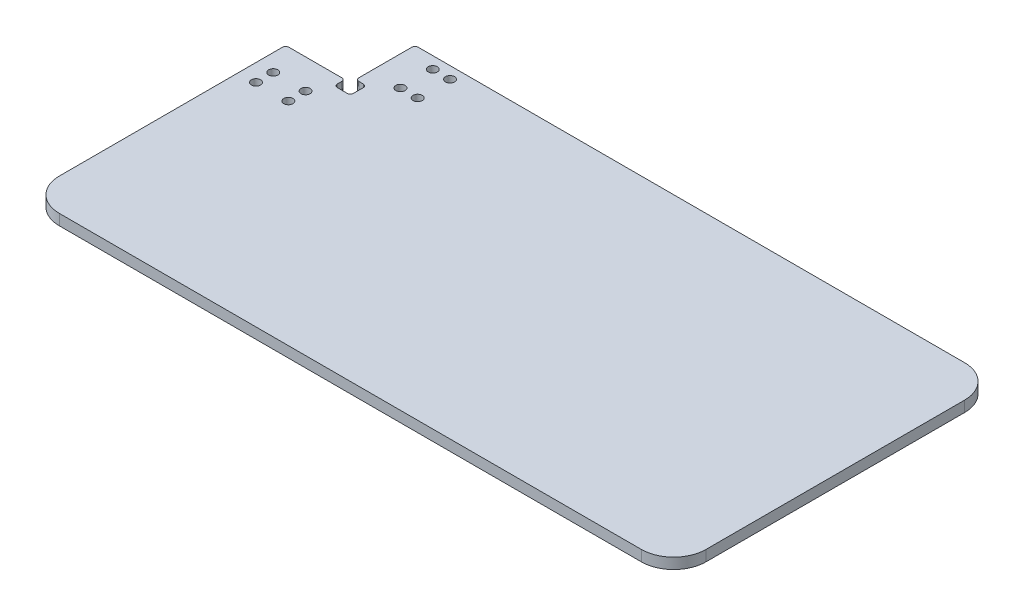
ISO-10303-21;
HEADER;
FILE_DESCRIPTION(('STEP AP214'),'2;1');
FILE_NAME('part.step','',(''),(''),'','','');
FILE_SCHEMA(('AUTOMOTIVE_DESIGN { 1 0 10303 214 1 1 1 1 }'));
ENDSEC;
DATA;
#1=APPLICATION_CONTEXT('core data for automotive mechanical design processes');
#2=APPLICATION_PROTOCOL_DEFINITION('international standard','automotive_design',2000,#1);
#3=PRODUCT_CONTEXT('',#1,'mechanical');
#4=PRODUCT('Part','Part','',(#3));
#5=PRODUCT_RELATED_PRODUCT_CATEGORY('part','',(#4));
#6=PRODUCT_DEFINITION_FORMATION('','',#4);
#7=PRODUCT_DEFINITION_CONTEXT('part definition',#1,'design');
#8=PRODUCT_DEFINITION('design','',#6,#7);
#9=PRODUCT_DEFINITION_SHAPE('','',#8);
#10=(LENGTH_UNIT() NAMED_UNIT(*) SI_UNIT(.MILLI.,.METRE.));
#11=(NAMED_UNIT(*) PLANE_ANGLE_UNIT() SI_UNIT($,.RADIAN.));
#12=(NAMED_UNIT(*) SI_UNIT($,.STERADIAN.) SOLID_ANGLE_UNIT());
#13=UNCERTAINTY_MEASURE_WITH_UNIT(LENGTH_MEASURE(1.E-05),#10,'distance_accuracy_value','');
#14=(GEOMETRIC_REPRESENTATION_CONTEXT(3) GLOBAL_UNCERTAINTY_ASSIGNED_CONTEXT((#13)) GLOBAL_UNIT_ASSIGNED_CONTEXT((#10,
#11,#12)) REPRESENTATION_CONTEXT('',''));
#15=CARTESIAN_POINT('',(0.,0.,0.));
#16=DIRECTION('',(0.,0.,1.));
#17=DIRECTION('',(1.,0.,0.));
#18=AXIS2_PLACEMENT_3D('',#15,#16,#17);
#19=CARTESIAN_POINT('',(0.,10.,0.));
#20=DIRECTION('',(0.,1.,0.));
#21=DIRECTION('',(0.,0.,1.));
#22=AXIS2_PLACEMENT_3D('',#19,#20,#21);
#23=PLANE('',#22);
#24=CARTESIAN_POINT('',(16.,10.,103.5));
#25=DIRECTION('',(0.,1.,0.));
#26=DIRECTION('',(0.,0.,1.));
#27=AXIS2_PLACEMENT_3D('',#24,#25,#26);
#28=CIRCLE('',#27,4.25000000000001);
#29=CARTESIAN_POINT('',(16.,10.,107.75));
#30=VERTEX_POINT('',#29);
#31=EDGE_CURVE('E481',#30,#30,#28,.T.);
#32=ORIENTED_EDGE('',*,*,#31,.F.);
#33=EDGE_LOOP('',(#32));
#34=FACE_BOUND('',#33,.T.);
#35=CARTESIAN_POINT('',(16.,10.,87.5));
#36=DIRECTION('',(0.,1.,0.));
#37=DIRECTION('',(0.,0.,1.));
#38=AXIS2_PLACEMENT_3D('',#35,#36,#37);
#39=CIRCLE('',#38,4.25000000000001);
#40=CARTESIAN_POINT('',(16.,10.,91.75));
#41=VERTEX_POINT('',#40);
#42=EDGE_CURVE('E469',#41,#41,#39,.T.);
#43=ORIENTED_EDGE('',*,*,#42,.F.);
#44=EDGE_LOOP('',(#43));
#45=FACE_BOUND('',#44,.T.);
#46=CARTESIAN_POINT('',(103.5,10.,41.));
#47=DIRECTION('',(0.,1.,0.));
#48=DIRECTION('',(0.,0.,1.));
#49=AXIS2_PLACEMENT_3D('',#46,#47,#48);
#50=CIRCLE('',#49,4.25000000000001);
#51=CARTESIAN_POINT('',(103.5,10.,45.25));
#52=VERTEX_POINT('',#51);
#53=EDGE_CURVE('E457',#52,#52,#50,.T.);
#54=ORIENTED_EDGE('',*,*,#53,.F.);
#55=EDGE_LOOP('',(#54));
#56=FACE_BOUND('',#55,.T.);
#57=CARTESIAN_POINT('',(103.5,10.,11.));
#58=DIRECTION('',(0.,1.,0.));
#59=DIRECTION('',(0.,0.,1.));
#60=AXIS2_PLACEMENT_3D('',#57,#58,#59);
#61=CIRCLE('',#60,4.25000000000001);
#62=CARTESIAN_POINT('',(103.5,10.,15.25));
#63=VERTEX_POINT('',#62);
#64=EDGE_CURVE('E210',#63,#63,#61,.T.);
#65=ORIENTED_EDGE('',*,*,#64,.F.);
#66=EDGE_LOOP('',(#65));
#67=FACE_BOUND('',#66,.T.);
#68=DIRECTION('',(0.,0.,-1.));
#69=VECTOR('',#68,1.);
#70=CARTESIAN_POINT('',(55.,10.,70.));
#71=LINE('',#70,#69);
#72=CARTESIAN_POINT('',(55.,10.,67.));
#73=VERTEX_POINT('',#72);
#74=CARTESIAN_POINT('',(55.,10.,63.));
#75=VERTEX_POINT('',#74);
#76=EDGE_CURVE('E324',#73,#75,#71,.T.);
#77=ORIENTED_EDGE('',*,*,#76,.T.);
#78=CARTESIAN_POINT('',(52.,10.,63.));
#79=DIRECTION('',(0.,1.,0.));
#80=DIRECTION('',(0.,0.,1.));
#81=AXIS2_PLACEMENT_3D('',#78,#79,#80);
#82=CIRCLE('',#81,3.);
#83=CARTESIAN_POINT('',(52.,10.,60.));
#84=VERTEX_POINT('',#83);
#85=EDGE_CURVE('E291',#75,#84,#82,.T.);
#86=ORIENTED_EDGE('',*,*,#85,.T.);
#87=DIRECTION('',(-1.,0.,0.));
#88=VECTOR('',#87,1.);
#89=CARTESIAN_POINT('',(55.,10.,60.));
#90=LINE('',#89,#88);
#91=CARTESIAN_POINT('',(3.00000000000002,10.,60.));
#92=VERTEX_POINT('',#91);
#93=EDGE_CURVE('E330',#84,#92,#90,.T.);
#94=ORIENTED_EDGE('',*,*,#93,.T.);
#95=CARTESIAN_POINT('',(3.,10.,63.));
#96=DIRECTION('',(0.,1.,0.));
#97=DIRECTION('',(0.,0.,1.));
#98=AXIS2_PLACEMENT_3D('',#95,#96,#97);
#99=CIRCLE('',#98,3.);
#100=CARTESIAN_POINT('',(0.,10.,63.));
#101=VERTEX_POINT('',#100);
#102=EDGE_CURVE('E52',#92,#101,#99,.T.);
#103=ORIENTED_EDGE('',*,*,#102,.T.);
#104=DIRECTION('',(0.,0.,1.));
#105=VECTOR('',#104,1.);
#106=CARTESIAN_POINT('',(0.,10.,60.));
#107=LINE('',#106,#105);
#108=CARTESIAN_POINT('',(0.,10.,270.));
#109=VERTEX_POINT('',#108);
#110=EDGE_CURVE('E332',#101,#109,#107,.T.);
#111=ORIENTED_EDGE('',*,*,#110,.T.);
#112=CARTESIAN_POINT('',(30.0000000000001,10.,270.));
#113=DIRECTION('',(0.,1.,0.));
#114=DIRECTION('',(0.,0.,1.));
#115=AXIS2_PLACEMENT_3D('',#112,#113,#114);
#116=CIRCLE('',#115,30.);
#117=CARTESIAN_POINT('',(30.0000000000001,10.,300.));
#118=VERTEX_POINT('',#117);
#119=EDGE_CURVE('E242',#109,#118,#116,.T.);
#120=ORIENTED_EDGE('',*,*,#119,.T.);
#121=DIRECTION('',(1.,0.,0.));
#122=VECTOR('',#121,1.);
#123=CARTESIAN_POINT('',(1.02132162786543E-13,10.,300.));
#124=LINE('',#123,#122);
#125=CARTESIAN_POINT('',(570.,10.,300.));
#126=VERTEX_POINT('',#125);
#127=EDGE_CURVE('E198',#118,#126,#124,.T.);
#128=ORIENTED_EDGE('',*,*,#127,.T.);
#129=CARTESIAN_POINT('',(570.,10.,270.));
#130=DIRECTION('',(0.,1.,0.));
#131=DIRECTION('',(0.,0.,1.));
#132=AXIS2_PLACEMENT_3D('',#129,#130,#131);
#133=CIRCLE('',#132,30.);
#134=CARTESIAN_POINT('',(600.,10.,270.));
#135=VERTEX_POINT('',#134);
#136=EDGE_CURVE('E240',#126,#135,#133,.T.);
#137=ORIENTED_EDGE('',*,*,#136,.T.);
#138=DIRECTION('',(0.,0.,-1.));
#139=VECTOR('',#138,1.);
#140=CARTESIAN_POINT('',(600.,10.,0.));
#141=LINE('',#140,#139);
#142=CARTESIAN_POINT('',(600.,10.,30.));
#143=VERTEX_POINT('',#142);
#144=EDGE_CURVE('E232',#135,#143,#141,.T.);
#145=ORIENTED_EDGE('',*,*,#144,.T.);
#146=CARTESIAN_POINT('',(570.,10.,30.));
#147=DIRECTION('',(0.,1.,0.));
#148=DIRECTION('',(0.,0.,1.));
#149=AXIS2_PLACEMENT_3D('',#146,#147,#148);
#150=CIRCLE('',#149,30.);
#151=CARTESIAN_POINT('',(570.,10.,0.));
#152=VERTEX_POINT('',#151);
#153=EDGE_CURVE('E244',#143,#152,#150,.T.);
#154=ORIENTED_EDGE('',*,*,#153,.T.);
#155=DIRECTION('',(-1.,0.,0.));
#156=VECTOR('',#155,1.);
#157=CARTESIAN_POINT('',(60.,10.,0.));
#158=LINE('',#157,#156);
#159=CARTESIAN_POINT('',(63.,10.,0.));
#160=VERTEX_POINT('',#159);
#161=EDGE_CURVE('E196',#152,#160,#158,.T.);
#162=ORIENTED_EDGE('',*,*,#161,.T.);
#163=CARTESIAN_POINT('',(63.,10.,3.));
#164=DIRECTION('',(0.,1.,0.));
#165=DIRECTION('',(0.,0.,1.));
#166=AXIS2_PLACEMENT_3D('',#163,#164,#165);
#167=CIRCLE('',#166,3.);
#168=CARTESIAN_POINT('',(60.,10.,3.));
#169=VERTEX_POINT('',#168);
#170=EDGE_CURVE('E287',#160,#169,#167,.T.);
#171=ORIENTED_EDGE('',*,*,#170,.T.);
#172=DIRECTION('',(0.,0.,1.));
#173=VECTOR('',#172,1.);
#174=CARTESIAN_POINT('',(60.,10.,0.));
#175=LINE('',#174,#173);
#176=CARTESIAN_POINT('',(60.,10.,52.));
#177=VERTEX_POINT('',#176);
#178=EDGE_CURVE('E442',#169,#177,#175,.T.);
#179=ORIENTED_EDGE('',*,*,#178,.T.);
#180=CARTESIAN_POINT('',(63.,10.,52.));
#181=DIRECTION('',(0.,1.,0.));
#182=DIRECTION('',(0.,0.,1.));
#183=AXIS2_PLACEMENT_3D('',#180,#181,#182);
#184=CIRCLE('',#183,3.);
#185=CARTESIAN_POINT('',(63.,10.,55.));
#186=VERTEX_POINT('',#185);
#187=EDGE_CURVE('E289',#177,#186,#184,.T.);
#188=ORIENTED_EDGE('',*,*,#187,.T.);
#189=DIRECTION('',(1.,0.,0.));
#190=VECTOR('',#189,1.);
#191=CARTESIAN_POINT('',(60.,10.,55.));
#192=LINE('',#191,#190);
#193=CARTESIAN_POINT('',(67.,10.,55.));
#194=VERTEX_POINT('',#193);
#195=EDGE_CURVE('E441',#186,#194,#192,.T.);
#196=ORIENTED_EDGE('',*,*,#195,.T.);
#197=CARTESIAN_POINT('',(67.,10.,58.));
#198=DIRECTION('',(0.,1.,0.));
#199=DIRECTION('',(0.,0.,1.));
#200=AXIS2_PLACEMENT_3D('',#197,#198,#199);
#201=CIRCLE('',#200,3.);
#202=CARTESIAN_POINT('',(70.,10.,58.));
#203=VERTEX_POINT('',#202);
#204=EDGE_CURVE('E304',#194,#203,#201,.F.);
#205=ORIENTED_EDGE('',*,*,#204,.T.);
#206=DIRECTION('',(0.,0.,1.));
#207=VECTOR('',#206,1.);
#208=CARTESIAN_POINT('',(70.,10.,55.));
#209=LINE('',#208,#207);
#210=CARTESIAN_POINT('',(70.,10.,67.));
#211=VERTEX_POINT('',#210);
#212=EDGE_CURVE('E334',#203,#211,#209,.T.);
#213=ORIENTED_EDGE('',*,*,#212,.T.);
#214=CARTESIAN_POINT('',(67.,10.,67.));
#215=DIRECTION('',(0.,1.,0.));
#216=DIRECTION('',(0.,0.,1.));
#217=AXIS2_PLACEMENT_3D('',#214,#215,#216);
#218=CIRCLE('',#217,3.);
#219=CARTESIAN_POINT('',(67.,10.,70.));
#220=VERTEX_POINT('',#219);
#221=EDGE_CURVE('E308',#211,#220,#218,.F.);
#222=ORIENTED_EDGE('',*,*,#221,.T.);
#223=DIRECTION('',(-1.,0.,0.));
#224=VECTOR('',#223,1.);
#225=CARTESIAN_POINT('',(70.,10.,70.));
#226=LINE('',#225,#224);
#227=CARTESIAN_POINT('',(58.,10.,70.));
#228=VERTEX_POINT('',#227);
#229=EDGE_CURVE('E326',#220,#228,#226,.T.);
#230=ORIENTED_EDGE('',*,*,#229,.T.);
#231=CARTESIAN_POINT('',(58.,10.,67.));
#232=DIRECTION('',(0.,1.,0.));
#233=DIRECTION('',(0.,0.,1.));
#234=AXIS2_PLACEMENT_3D('',#231,#232,#233);
#235=CIRCLE('',#234,3.);
#236=EDGE_CURVE('E11',#228,#73,#235,.F.);
#237=ORIENTED_EDGE('',*,*,#236,.T.);
#238=EDGE_LOOP('',(#77,#86,#94,#103,#111,#120,#128,#137,#145,#154,#162,#171,#179,#188,#196,#205,
#213,#222,#230,#237));
#239=FACE_BOUND('',#238,.T.);
#240=CARTESIAN_POINT('',(87.5,10.,11.));
#241=DIRECTION('',(0.,1.,0.));
#242=DIRECTION('',(0.,0.,1.));
#243=AXIS2_PLACEMENT_3D('',#240,#241,#242);
#244=CIRCLE('',#243,4.25000000000001);
#245=CARTESIAN_POINT('',(87.5,10.,15.25));
#246=VERTEX_POINT('',#245);
#247=EDGE_CURVE('E451',#246,#246,#244,.T.);
#248=ORIENTED_EDGE('',*,*,#247,.F.);
#249=EDGE_LOOP('',(#248));
#250=FACE_BOUND('',#249,.T.);
#251=CARTESIAN_POINT('',(87.5,10.,41.));
#252=DIRECTION('',(0.,1.,0.));
#253=DIRECTION('',(0.,0.,1.));
#254=AXIS2_PLACEMENT_3D('',#251,#252,#253);
#255=CIRCLE('',#254,4.25000000000001);
#256=CARTESIAN_POINT('',(87.5,10.,45.25));
#257=VERTEX_POINT('',#256);
#258=EDGE_CURVE('E463',#257,#257,#255,.T.);
#259=ORIENTED_EDGE('',*,*,#258,.F.);
#260=EDGE_LOOP('',(#259));
#261=FACE_BOUND('',#260,.T.);
#262=CARTESIAN_POINT('',(46.,10.,87.5));
#263=DIRECTION('',(0.,1.,0.));
#264=DIRECTION('',(0.,0.,1.));
#265=AXIS2_PLACEMENT_3D('',#262,#263,#264);
#266=CIRCLE('',#265,4.25000000000003);
#267=CARTESIAN_POINT('',(46.,10.,91.75));
#268=VERTEX_POINT('',#267);
#269=EDGE_CURVE('E475',#268,#268,#266,.T.);
#270=ORIENTED_EDGE('',*,*,#269,.F.);
#271=EDGE_LOOP('',(#270));
#272=FACE_BOUND('',#271,.T.);
#273=CARTESIAN_POINT('',(46.,10.,103.5));
#274=DIRECTION('',(0.,1.,0.));
#275=DIRECTION('',(0.,0.,1.));
#276=AXIS2_PLACEMENT_3D('',#273,#274,#275);
#277=CIRCLE('',#276,4.25000000000002);
#278=CARTESIAN_POINT('',(46.,10.,107.75));
#279=VERTEX_POINT('',#278);
#280=EDGE_CURVE('E487',#279,#279,#277,.T.);
#281=ORIENTED_EDGE('',*,*,#280,.F.);
#282=EDGE_LOOP('',(#281));
#283=FACE_BOUND('',#282,.T.);
#284=ADVANCED_FACE('F37',(#34,#45,#56,#67,#239,#250,#261,#272,#283),#23,.T.);
#285=CARTESIAN_POINT('',(0.,0.,0.));
#286=DIRECTION('',(0.,1.,0.));
#287=DIRECTION('',(0.,0.,1.));
#288=AXIS2_PLACEMENT_3D('',#285,#286,#287);
#289=PLANE('',#288);
#290=DIRECTION('',(-1.,0.,0.));
#291=VECTOR('',#290,1.);
#292=CARTESIAN_POINT('',(55.,0.,60.));
#293=LINE('',#292,#291);
#294=CARTESIAN_POINT('',(52.,0.,60.));
#295=VERTEX_POINT('',#294);
#296=CARTESIAN_POINT('',(3.00000000000002,0.,60.));
#297=VERTEX_POINT('',#296);
#298=EDGE_CURVE('E225',#295,#297,#293,.T.);
#299=ORIENTED_EDGE('',*,*,#298,.F.);
#300=CARTESIAN_POINT('',(52.,0.,63.));
#301=DIRECTION('',(0.,1.,0.));
#302=DIRECTION('',(0.,0.,1.));
#303=AXIS2_PLACEMENT_3D('',#300,#301,#302);
#304=CIRCLE('',#303,3.);
#305=CARTESIAN_POINT('',(55.,0.,63.));
#306=VERTEX_POINT('',#305);
#307=EDGE_CURVE('E284',#295,#306,#304,.F.);
#308=ORIENTED_EDGE('',*,*,#307,.T.);
#309=DIRECTION('',(0.,0.,-1.));
#310=VECTOR('',#309,1.);
#311=CARTESIAN_POINT('',(55.,0.,70.));
#312=LINE('',#311,#310);
#313=CARTESIAN_POINT('',(55.,0.,67.));
#314=VERTEX_POINT('',#313);
#315=EDGE_CURVE('E222',#314,#306,#312,.T.);
#316=ORIENTED_EDGE('',*,*,#315,.F.);
#317=CARTESIAN_POINT('',(58.,0.,67.));
#318=DIRECTION('',(0.,1.,0.));
#319=DIRECTION('',(0.,0.,1.));
#320=AXIS2_PLACEMENT_3D('',#317,#318,#319);
#321=CIRCLE('',#320,3.);
#322=CARTESIAN_POINT('',(58.,0.,70.));
#323=VERTEX_POINT('',#322);
#324=EDGE_CURVE('E45',#314,#323,#321,.T.);
#325=ORIENTED_EDGE('',*,*,#324,.T.);
#326=DIRECTION('',(-1.,0.,0.));
#327=VECTOR('',#326,1.);
#328=CARTESIAN_POINT('',(70.,0.,70.));
#329=LINE('',#328,#327);
#330=CARTESIAN_POINT('',(67.,0.,70.));
#331=VERTEX_POINT('',#330);
#332=EDGE_CURVE('E219',#331,#323,#329,.T.);
#333=ORIENTED_EDGE('',*,*,#332,.F.);
#334=CARTESIAN_POINT('',(67.,0.,67.));
#335=DIRECTION('',(0.,1.,0.));
#336=DIRECTION('',(0.,0.,1.));
#337=AXIS2_PLACEMENT_3D('',#334,#335,#336);
#338=CIRCLE('',#337,3.);
#339=CARTESIAN_POINT('',(70.,0.,67.));
#340=VERTEX_POINT('',#339);
#341=EDGE_CURVE('E306',#331,#340,#338,.T.);
#342=ORIENTED_EDGE('',*,*,#341,.T.);
#343=DIRECTION('',(0.,0.,1.));
#344=VECTOR('',#343,1.);
#345=CARTESIAN_POINT('',(70.,0.,55.));
#346=LINE('',#345,#344);
#347=CARTESIAN_POINT('',(70.,0.,58.));
#348=VERTEX_POINT('',#347);
#349=EDGE_CURVE('E216',#348,#340,#346,.T.);
#350=ORIENTED_EDGE('',*,*,#349,.F.);
#351=CARTESIAN_POINT('',(67.,0.,58.));
#352=DIRECTION('',(0.,1.,0.));
#353=DIRECTION('',(0.,0.,1.));
#354=AXIS2_PLACEMENT_3D('',#351,#352,#353);
#355=CIRCLE('',#354,3.);
#356=CARTESIAN_POINT('',(67.,0.,55.));
#357=VERTEX_POINT('',#356);
#358=EDGE_CURVE('E302',#348,#357,#355,.T.);
#359=ORIENTED_EDGE('',*,*,#358,.T.);
#360=DIRECTION('',(1.,0.,0.));
#361=VECTOR('',#360,1.);
#362=CARTESIAN_POINT('',(60.,0.,55.));
#363=LINE('',#362,#361);
#364=CARTESIAN_POINT('',(63.,0.,55.));
#365=VERTEX_POINT('',#364);
#366=EDGE_CURVE('E208',#365,#357,#363,.T.);
#367=ORIENTED_EDGE('',*,*,#366,.F.);
#368=CARTESIAN_POINT('',(63.,0.,52.));
#369=DIRECTION('',(0.,1.,0.));
#370=DIRECTION('',(0.,0.,1.));
#371=AXIS2_PLACEMENT_3D('',#368,#369,#370);
#372=CIRCLE('',#371,3.);
#373=CARTESIAN_POINT('',(60.,0.,52.));
#374=VERTEX_POINT('',#373);
#375=EDGE_CURVE('E282',#365,#374,#372,.F.);
#376=ORIENTED_EDGE('',*,*,#375,.T.);
#377=DIRECTION('',(0.,0.,1.));
#378=VECTOR('',#377,1.);
#379=CARTESIAN_POINT('',(60.,0.,0.));
#380=LINE('',#379,#378);
#381=CARTESIAN_POINT('',(60.,0.,3.));
#382=VERTEX_POINT('',#381);
#383=EDGE_CURVE('E205',#382,#374,#380,.T.);
#384=ORIENTED_EDGE('',*,*,#383,.F.);
#385=CARTESIAN_POINT('',(63.,0.,3.));
#386=DIRECTION('',(0.,1.,0.));
#387=DIRECTION('',(0.,0.,1.));
#388=AXIS2_PLACEMENT_3D('',#385,#386,#387);
#389=CIRCLE('',#388,3.);
#390=CARTESIAN_POINT('',(63.,0.,0.));
#391=VERTEX_POINT('',#390);
#392=EDGE_CURVE('E204',#382,#391,#389,.F.);
#393=ORIENTED_EDGE('',*,*,#392,.T.);
#394=DIRECTION('',(-1.,0.,0.));
#395=VECTOR('',#394,1.);
#396=CARTESIAN_POINT('',(60.,0.,0.));
#397=LINE('',#396,#395);
#398=CARTESIAN_POINT('',(570.,0.,0.));
#399=VERTEX_POINT('',#398);
#400=EDGE_CURVE('E193',#399,#391,#397,.T.);
#401=ORIENTED_EDGE('',*,*,#400,.F.);
#402=CARTESIAN_POINT('',(570.,0.,30.));
#403=DIRECTION('',(0.,1.,0.));
#404=DIRECTION('',(0.,0.,1.));
#405=AXIS2_PLACEMENT_3D('',#402,#403,#404);
#406=CIRCLE('',#405,30.);
#407=CARTESIAN_POINT('',(600.,0.,30.));
#408=VERTEX_POINT('',#407);
#409=EDGE_CURVE('E176',#399,#408,#406,.F.);
#410=ORIENTED_EDGE('',*,*,#409,.T.);
#411=DIRECTION('',(0.,0.,-1.));
#412=VECTOR('',#411,1.);
#413=CARTESIAN_POINT('',(600.,0.,0.));
#414=LINE('',#413,#412);
#415=CARTESIAN_POINT('',(600.,0.,270.));
#416=VERTEX_POINT('',#415);
#417=EDGE_CURVE('E206',#416,#408,#414,.T.);
#418=ORIENTED_EDGE('',*,*,#417,.F.);
#419=CARTESIAN_POINT('',(570.,0.,270.));
#420=DIRECTION('',(0.,1.,0.));
#421=DIRECTION('',(0.,0.,1.));
#422=AXIS2_PLACEMENT_3D('',#419,#420,#421);
#423=CIRCLE('',#422,30.);
#424=CARTESIAN_POINT('',(570.,0.,300.));
#425=VERTEX_POINT('',#424);
#426=EDGE_CURVE('E197',#416,#425,#423,.F.);
#427=ORIENTED_EDGE('',*,*,#426,.T.);
#428=DIRECTION('',(1.,0.,0.));
#429=VECTOR('',#428,1.);
#430=CARTESIAN_POINT('',(1.02132162786543E-13,0.,300.));
#431=LINE('',#430,#429);
#432=CARTESIAN_POINT('',(30.0000000000001,0.,300.));
#433=VERTEX_POINT('',#432);
#434=EDGE_CURVE('E230',#433,#425,#431,.T.);
#435=ORIENTED_EDGE('',*,*,#434,.F.);
#436=CARTESIAN_POINT('',(30.0000000000001,0.,270.));
#437=DIRECTION('',(0.,1.,0.));
#438=DIRECTION('',(0.,0.,1.));
#439=AXIS2_PLACEMENT_3D('',#436,#437,#438);
#440=CIRCLE('',#439,30.);
#441=CARTESIAN_POINT('',(0.,0.,270.));
#442=VERTEX_POINT('',#441);
#443=EDGE_CURVE('E187',#433,#442,#440,.F.);
#444=ORIENTED_EDGE('',*,*,#443,.T.);
#445=DIRECTION('',(0.,0.,1.));
#446=VECTOR('',#445,1.);
#447=CARTESIAN_POINT('',(0.,0.,60.));
#448=LINE('',#447,#446);
#449=CARTESIAN_POINT('',(0.,0.,63.));
#450=VERTEX_POINT('',#449);
#451=EDGE_CURVE('E228',#450,#442,#448,.T.);
#452=ORIENTED_EDGE('',*,*,#451,.F.);
#453=CARTESIAN_POINT('',(3.,0.,63.));
#454=DIRECTION('',(0.,1.,0.));
#455=DIRECTION('',(0.,0.,1.));
#456=AXIS2_PLACEMENT_3D('',#453,#454,#455);
#457=CIRCLE('',#456,3.);
#458=EDGE_CURVE('E279',#450,#297,#457,.F.);
#459=ORIENTED_EDGE('',*,*,#458,.T.);
#460=EDGE_LOOP('',(#299,#308,#316,#325,#333,#342,#350,#359,#367,#376,#384,#393,#401,#410,#418,
#427,#435,#444,#452,#459));
#461=FACE_BOUND('',#460,.T.);
#462=CARTESIAN_POINT('',(103.5,0.,11.));
#463=DIRECTION('',(0.,1.,0.));
#464=DIRECTION('',(0.,0.,1.));
#465=AXIS2_PLACEMENT_3D('',#462,#463,#464);
#466=CIRCLE('',#465,4.25000000000001);
#467=CARTESIAN_POINT('',(103.5,0.,15.25));
#468=VERTEX_POINT('',#467);
#469=EDGE_CURVE('E448',#468,#468,#466,.T.);
#470=ORIENTED_EDGE('',*,*,#469,.T.);
#471=EDGE_LOOP('',(#470));
#472=FACE_BOUND('',#471,.T.);
#473=CARTESIAN_POINT('',(87.5,0.,11.));
#474=DIRECTION('',(0.,1.,0.));
#475=DIRECTION('',(0.,0.,1.));
#476=AXIS2_PLACEMENT_3D('',#473,#474,#475);
#477=CIRCLE('',#476,4.25000000000001);
#478=CARTESIAN_POINT('',(87.5,0.,15.25));
#479=VERTEX_POINT('',#478);
#480=EDGE_CURVE('E454',#479,#479,#477,.T.);
#481=ORIENTED_EDGE('',*,*,#480,.T.);
#482=EDGE_LOOP('',(#481));
#483=FACE_BOUND('',#482,.T.);
#484=CARTESIAN_POINT('',(103.5,0.,41.));
#485=DIRECTION('',(0.,1.,0.));
#486=DIRECTION('',(0.,0.,1.));
#487=AXIS2_PLACEMENT_3D('',#484,#485,#486);
#488=CIRCLE('',#487,4.25000000000001);
#489=CARTESIAN_POINT('',(103.5,0.,45.25));
#490=VERTEX_POINT('',#489);
#491=EDGE_CURVE('E460',#490,#490,#488,.T.);
#492=ORIENTED_EDGE('',*,*,#491,.T.);
#493=EDGE_LOOP('',(#492));
#494=FACE_BOUND('',#493,.T.);
#495=CARTESIAN_POINT('',(87.5,0.,41.));
#496=DIRECTION('',(0.,1.,0.));
#497=DIRECTION('',(0.,0.,1.));
#498=AXIS2_PLACEMENT_3D('',#495,#496,#497);
#499=CIRCLE('',#498,4.25000000000001);
#500=CARTESIAN_POINT('',(87.5,0.,45.25));
#501=VERTEX_POINT('',#500);
#502=EDGE_CURVE('E466',#501,#501,#499,.T.);
#503=ORIENTED_EDGE('',*,*,#502,.T.);
#504=EDGE_LOOP('',(#503));
#505=FACE_BOUND('',#504,.T.);
#506=CARTESIAN_POINT('',(16.,0.,87.5));
#507=DIRECTION('',(0.,1.,0.));
#508=DIRECTION('',(0.,0.,1.));
#509=AXIS2_PLACEMENT_3D('',#506,#507,#508);
#510=CIRCLE('',#509,4.25000000000001);
#511=CARTESIAN_POINT('',(16.,0.,91.75));
#512=VERTEX_POINT('',#511);
#513=EDGE_CURVE('E472',#512,#512,#510,.T.);
#514=ORIENTED_EDGE('',*,*,#513,.T.);
#515=EDGE_LOOP('',(#514));
#516=FACE_BOUND('',#515,.T.);
#517=CARTESIAN_POINT('',(46.,0.,87.5));
#518=DIRECTION('',(0.,1.,0.));
#519=DIRECTION('',(0.,0.,1.));
#520=AXIS2_PLACEMENT_3D('',#517,#518,#519);
#521=CIRCLE('',#520,4.25000000000003);
#522=CARTESIAN_POINT('',(46.,0.,91.75));
#523=VERTEX_POINT('',#522);
#524=EDGE_CURVE('E478',#523,#523,#521,.T.);
#525=ORIENTED_EDGE('',*,*,#524,.T.);
#526=EDGE_LOOP('',(#525));
#527=FACE_BOUND('',#526,.T.);
#528=CARTESIAN_POINT('',(16.,0.,103.5));
#529=DIRECTION('',(0.,1.,0.));
#530=DIRECTION('',(0.,0.,1.));
#531=AXIS2_PLACEMENT_3D('',#528,#529,#530);
#532=CIRCLE('',#531,4.25000000000001);
#533=CARTESIAN_POINT('',(16.,0.,107.75));
#534=VERTEX_POINT('',#533);
#535=EDGE_CURVE('E484',#534,#534,#532,.T.);
#536=ORIENTED_EDGE('',*,*,#535,.T.);
#537=EDGE_LOOP('',(#536));
#538=FACE_BOUND('',#537,.T.);
#539=CARTESIAN_POINT('',(46.,0.,103.5));
#540=DIRECTION('',(0.,1.,0.));
#541=DIRECTION('',(0.,0.,1.));
#542=AXIS2_PLACEMENT_3D('',#539,#540,#541);
#543=CIRCLE('',#542,4.25000000000002);
#544=CARTESIAN_POINT('',(46.,0.,107.75));
#545=VERTEX_POINT('',#544);
#546=EDGE_CURVE('E490',#545,#545,#543,.T.);
#547=ORIENTED_EDGE('',*,*,#546,.T.);
#548=EDGE_LOOP('',(#547));
#549=FACE_BOUND('',#548,.T.);
#550=ADVANCED_FACE('F201',(#461,#472,#483,#494,#505,#516,#527,#538,#549),#289,.F.);
#551=CARTESIAN_POINT('',(600.,10.,0.));
#552=DIRECTION('',(-1.,0.,0.));
#553=DIRECTION('',(0.,0.,1.));
#554=AXIS2_PLACEMENT_3D('',#551,#552,#553);
#555=PLANE('',#554);
#556=ORIENTED_EDGE('',*,*,#417,.T.);
#557=DIRECTION('',(0.,-1.,0.));
#558=VECTOR('',#557,1.);
#559=CARTESIAN_POINT('',(600.,10.,30.));
#560=LINE('',#559,#558);
#561=EDGE_CURVE('E181',#408,#143,#560,.F.);
#562=ORIENTED_EDGE('',*,*,#561,.T.);
#563=ORIENTED_EDGE('',*,*,#144,.F.);
#564=DIRECTION('',(0.,-1.,0.));
#565=VECTOR('',#564,1.);
#566=CARTESIAN_POINT('',(600.,10.,270.));
#567=LINE('',#566,#565);
#568=EDGE_CURVE('E186',#135,#416,#567,.T.);
#569=ORIENTED_EDGE('',*,*,#568,.T.);
#570=EDGE_LOOP('',(#556,#562,#563,#569));
#571=FACE_BOUND('',#570,.T.);
#572=ADVANCED_FACE('F351',(#571),#555,.F.);
#573=CARTESIAN_POINT('',(60.,10.,0.));
#574=DIRECTION('',(0.,0.,1.));
#575=DIRECTION('',(1.,0.,0.));
#576=AXIS2_PLACEMENT_3D('',#573,#574,#575);
#577=PLANE('',#576);
#578=ORIENTED_EDGE('',*,*,#400,.T.);
#579=DIRECTION('',(0.,-1.,0.));
#580=VECTOR('',#579,1.);
#581=CARTESIAN_POINT('',(63.,10.,0.));
#582=LINE('',#581,#580);
#583=EDGE_CURVE('E297',#391,#160,#582,.F.);
#584=ORIENTED_EDGE('',*,*,#583,.T.);
#585=ORIENTED_EDGE('',*,*,#161,.F.);
#586=DIRECTION('',(0.,-1.,0.));
#587=VECTOR('',#586,1.);
#588=CARTESIAN_POINT('',(570.,10.,0.));
#589=LINE('',#588,#587);
#590=EDGE_CURVE('E180',#152,#399,#589,.T.);
#591=ORIENTED_EDGE('',*,*,#590,.T.);
#592=EDGE_LOOP('',(#578,#584,#585,#591));
#593=FACE_BOUND('',#592,.T.);
#594=ADVANCED_FACE('F192',(#593),#577,.F.);
#595=CARTESIAN_POINT('',(60.,10.,0.));
#596=DIRECTION('',(1.,0.,0.));
#597=DIRECTION('',(0.,0.,-1.));
#598=AXIS2_PLACEMENT_3D('',#595,#596,#597);
#599=PLANE('',#598);
#600=ORIENTED_EDGE('',*,*,#383,.T.);
#601=DIRECTION('',(0.,-1.,0.));
#602=VECTOR('',#601,1.);
#603=CARTESIAN_POINT('',(60.,10.,52.));
#604=LINE('',#603,#602);
#605=EDGE_CURVE('E60',#374,#177,#604,.F.);
#606=ORIENTED_EDGE('',*,*,#605,.T.);
#607=ORIENTED_EDGE('',*,*,#178,.F.);
#608=DIRECTION('',(0.,-1.,0.));
#609=VECTOR('',#608,1.);
#610=CARTESIAN_POINT('',(60.,10.,3.));
#611=LINE('',#610,#609);
#612=EDGE_CURVE('E293',#169,#382,#611,.T.);
#613=ORIENTED_EDGE('',*,*,#612,.T.);
#614=EDGE_LOOP('',(#600,#606,#607,#613));
#615=FACE_BOUND('',#614,.T.);
#616=ADVANCED_FACE('F411',(#615),#599,.F.);
#617=CARTESIAN_POINT('',(60.,10.,55.));
#618=DIRECTION('',(0.,0.,-1.));
#619=DIRECTION('',(-1.,0.,0.));
#620=AXIS2_PLACEMENT_3D('',#617,#618,#619);
#621=PLANE('',#620);
#622=ORIENTED_EDGE('',*,*,#366,.T.);
#623=DIRECTION('',(0.,-1.,0.));
#624=VECTOR('',#623,1.);
#625=CARTESIAN_POINT('',(67.,10.,55.));
#626=LINE('',#625,#624);
#627=EDGE_CURVE('E262',#357,#194,#626,.F.);
#628=ORIENTED_EDGE('',*,*,#627,.T.);
#629=ORIENTED_EDGE('',*,*,#195,.F.);
#630=DIRECTION('',(0.,-1.,0.));
#631=VECTOR('',#630,1.);
#632=CARTESIAN_POINT('',(63.,10.,55.));
#633=LINE('',#632,#631);
#634=EDGE_CURVE('E259',#186,#365,#633,.T.);
#635=ORIENTED_EDGE('',*,*,#634,.T.);
#636=EDGE_LOOP('',(#622,#628,#629,#635));
#637=FACE_BOUND('',#636,.T.);
#638=ADVANCED_FACE('F407',(#637),#621,.F.);
#639=CARTESIAN_POINT('',(70.,10.,55.));
#640=DIRECTION('',(1.,0.,0.));
#641=DIRECTION('',(0.,0.,-1.));
#642=AXIS2_PLACEMENT_3D('',#639,#640,#641);
#643=PLANE('',#642);
#644=ORIENTED_EDGE('',*,*,#212,.F.);
#645=DIRECTION('',(0.,-1.,0.));
#646=VECTOR('',#645,1.);
#647=CARTESIAN_POINT('',(70.,0.,58.));
#648=LINE('',#647,#646);
#649=EDGE_CURVE('E256',#203,#348,#648,.T.);
#650=ORIENTED_EDGE('',*,*,#649,.T.);
#651=ORIENTED_EDGE('',*,*,#349,.T.);
#652=DIRECTION('',(0.,-1.,0.));
#653=VECTOR('',#652,1.);
#654=CARTESIAN_POINT('',(70.,10.,67.));
#655=LINE('',#654,#653);
#656=EDGE_CURVE('E254',#340,#211,#655,.F.);
#657=ORIENTED_EDGE('',*,*,#656,.T.);
#658=EDGE_LOOP('',(#644,#650,#651,#657));
#659=FACE_BOUND('',#658,.T.);
#660=ADVANCED_FACE('F404',(#659),#643,.F.);
#661=CARTESIAN_POINT('',(70.,10.,70.));
#662=DIRECTION('',(0.,0.,1.));
#663=DIRECTION('',(1.,0.,0.));
#664=AXIS2_PLACEMENT_3D('',#661,#662,#663);
#665=PLANE('',#664);
#666=ORIENTED_EDGE('',*,*,#229,.F.);
#667=DIRECTION('',(0.,-1.,0.));
#668=VECTOR('',#667,1.);
#669=CARTESIAN_POINT('',(67.,0.,70.));
#670=LINE('',#669,#668);
#671=EDGE_CURVE('E266',#220,#331,#670,.T.);
#672=ORIENTED_EDGE('',*,*,#671,.T.);
#673=ORIENTED_EDGE('',*,*,#332,.T.);
#674=DIRECTION('',(0.,-1.,0.));
#675=VECTOR('',#674,1.);
#676=CARTESIAN_POINT('',(58.,10.,70.));
#677=LINE('',#676,#675);
#678=EDGE_CURVE('E264',#323,#228,#677,.F.);
#679=ORIENTED_EDGE('',*,*,#678,.T.);
#680=EDGE_LOOP('',(#666,#672,#673,#679));
#681=FACE_BOUND('',#680,.T.);
#682=ADVANCED_FACE('F316',(#681),#665,.F.);
#683=CARTESIAN_POINT('',(55.,10.,70.));
#684=DIRECTION('',(-1.,0.,0.));
#685=DIRECTION('',(0.,0.,1.));
#686=AXIS2_PLACEMENT_3D('',#683,#684,#685);
#687=PLANE('',#686);
#688=ORIENTED_EDGE('',*,*,#76,.F.);
#689=DIRECTION('',(0.,-1.,0.));
#690=VECTOR('',#689,1.);
#691=CARTESIAN_POINT('',(55.,0.,67.));
#692=LINE('',#691,#690);
#693=EDGE_CURVE('E271',#73,#314,#692,.T.);
#694=ORIENTED_EDGE('',*,*,#693,.T.);
#695=ORIENTED_EDGE('',*,*,#315,.T.);
#696=DIRECTION('',(0.,-1.,0.));
#697=VECTOR('',#696,1.);
#698=CARTESIAN_POINT('',(55.,10.,63.));
#699=LINE('',#698,#697);
#700=EDGE_CURVE('E269',#306,#75,#699,.F.);
#701=ORIENTED_EDGE('',*,*,#700,.T.);
#702=EDGE_LOOP('',(#688,#694,#695,#701));
#703=FACE_BOUND('',#702,.T.);
#704=ADVANCED_FACE('F328',(#703),#687,.F.);
#705=CARTESIAN_POINT('',(55.,10.,60.));
#706=DIRECTION('',(0.,0.,1.));
#707=DIRECTION('',(1.,0.,0.));
#708=AXIS2_PLACEMENT_3D('',#705,#706,#707);
#709=PLANE('',#708);
#710=ORIENTED_EDGE('',*,*,#93,.F.);
#711=DIRECTION('',(0.,-1.,0.));
#712=VECTOR('',#711,1.);
#713=CARTESIAN_POINT('',(52.,10.,60.));
#714=LINE('',#713,#712);
#715=EDGE_CURVE('E276',#84,#295,#714,.T.);
#716=ORIENTED_EDGE('',*,*,#715,.T.);
#717=ORIENTED_EDGE('',*,*,#298,.T.);
#718=DIRECTION('',(0.,-1.,0.));
#719=VECTOR('',#718,1.);
#720=CARTESIAN_POINT('',(3.,10.,60.));
#721=LINE('',#720,#719);
#722=EDGE_CURVE('E274',#297,#92,#721,.F.);
#723=ORIENTED_EDGE('',*,*,#722,.T.);
#724=EDGE_LOOP('',(#710,#716,#717,#723));
#725=FACE_BOUND('',#724,.T.);
#726=ADVANCED_FACE('F365',(#725),#709,.F.);
#727=CARTESIAN_POINT('',(0.,10.,60.));
#728=DIRECTION('',(1.,0.,0.));
#729=DIRECTION('',(0.,0.,-1.));
#730=AXIS2_PLACEMENT_3D('',#727,#728,#729);
#731=PLANE('',#730);
#732=ORIENTED_EDGE('',*,*,#110,.F.);
#733=DIRECTION('',(0.,-1.,0.));
#734=VECTOR('',#733,1.);
#735=CARTESIAN_POINT('',(0.,10.,63.));
#736=LINE('',#735,#734);
#737=EDGE_CURVE('E299',#101,#450,#736,.T.);
#738=ORIENTED_EDGE('',*,*,#737,.T.);
#739=ORIENTED_EDGE('',*,*,#451,.T.);
#740=DIRECTION('',(0.,-1.,0.));
#741=VECTOR('',#740,1.);
#742=CARTESIAN_POINT('',(0.,10.,270.));
#743=LINE('',#742,#741);
#744=EDGE_CURVE('E251',#442,#109,#743,.F.);
#745=ORIENTED_EDGE('',*,*,#744,.T.);
#746=EDGE_LOOP('',(#732,#738,#739,#745));
#747=FACE_BOUND('',#746,.T.);
#748=ADVANCED_FACE('F359',(#747),#731,.F.);
#749=CARTESIAN_POINT('',(1.02132162786543E-13,10.,300.));
#750=DIRECTION('',(0.,0.,-1.));
#751=DIRECTION('',(-1.,0.,0.));
#752=AXIS2_PLACEMENT_3D('',#749,#750,#751);
#753=PLANE('',#752);
#754=ORIENTED_EDGE('',*,*,#127,.F.);
#755=DIRECTION('',(0.,-1.,0.));
#756=VECTOR('',#755,1.);
#757=CARTESIAN_POINT('',(30.0000000000001,10.,300.));
#758=LINE('',#757,#756);
#759=EDGE_CURVE('E248',#118,#433,#758,.T.);
#760=ORIENTED_EDGE('',*,*,#759,.T.);
#761=ORIENTED_EDGE('',*,*,#434,.T.);
#762=DIRECTION('',(0.,-1.,0.));
#763=VECTOR('',#762,1.);
#764=CARTESIAN_POINT('',(570.,10.,300.));
#765=LINE('',#764,#763);
#766=EDGE_CURVE('E246',#425,#126,#765,.F.);
#767=ORIENTED_EDGE('',*,*,#766,.T.);
#768=EDGE_LOOP('',(#754,#760,#761,#767));
#769=FACE_BOUND('',#768,.T.);
#770=ADVANCED_FACE('F353',(#769),#753,.F.);
#771=CARTESIAN_POINT('',(103.5,10.,11.));
#772=DIRECTION('',(0.,-1.,0.));
#773=DIRECTION('',(0.,0.,-1.));
#774=AXIS2_PLACEMENT_3D('',#771,#772,#773);
#775=CYLINDRICAL_SURFACE('',#774,4.25000000000001);
#776=ORIENTED_EDGE('',*,*,#64,.T.);
#777=EDGE_LOOP('',(#776));
#778=FACE_BOUND('',#777,.T.);
#779=ORIENTED_EDGE('',*,*,#469,.F.);
#780=EDGE_LOOP('',(#779));
#781=FACE_BOUND('',#780,.T.);
#782=ADVANCED_FACE('F391',(#778,#781),#775,.F.);
#783=CARTESIAN_POINT('',(87.5,10.,11.));
#784=DIRECTION('',(0.,-1.,0.));
#785=DIRECTION('',(0.,0.,-1.));
#786=AXIS2_PLACEMENT_3D('',#783,#784,#785);
#787=CYLINDRICAL_SURFACE('',#786,4.25000000000001);
#788=ORIENTED_EDGE('',*,*,#247,.T.);
#789=EDGE_LOOP('',(#788));
#790=FACE_BOUND('',#789,.T.);
#791=ORIENTED_EDGE('',*,*,#480,.F.);
#792=EDGE_LOOP('',(#791));
#793=FACE_BOUND('',#792,.T.);
#794=ADVANCED_FACE('F523',(#790,#793),#787,.F.);
#795=CARTESIAN_POINT('',(103.5,10.,41.));
#796=DIRECTION('',(0.,-1.,0.));
#797=DIRECTION('',(0.,0.,-1.));
#798=AXIS2_PLACEMENT_3D('',#795,#796,#797);
#799=CYLINDRICAL_SURFACE('',#798,4.25000000000001);
#800=ORIENTED_EDGE('',*,*,#53,.T.);
#801=EDGE_LOOP('',(#800));
#802=FACE_BOUND('',#801,.T.);
#803=ORIENTED_EDGE('',*,*,#491,.F.);
#804=EDGE_LOOP('',(#803));
#805=FACE_BOUND('',#804,.T.);
#806=ADVANCED_FACE('F520',(#802,#805),#799,.F.);
#807=CARTESIAN_POINT('',(87.5,10.,41.));
#808=DIRECTION('',(0.,-1.,0.));
#809=DIRECTION('',(0.,0.,-1.));
#810=AXIS2_PLACEMENT_3D('',#807,#808,#809);
#811=CYLINDRICAL_SURFACE('',#810,4.25000000000001);
#812=ORIENTED_EDGE('',*,*,#258,.T.);
#813=EDGE_LOOP('',(#812));
#814=FACE_BOUND('',#813,.T.);
#815=ORIENTED_EDGE('',*,*,#502,.F.);
#816=EDGE_LOOP('',(#815));
#817=FACE_BOUND('',#816,.T.);
#818=ADVANCED_FACE('F516',(#814,#817),#811,.F.);
#819=CARTESIAN_POINT('',(16.,10.,87.5));
#820=DIRECTION('',(0.,-1.,0.));
#821=DIRECTION('',(0.,0.,-1.));
#822=AXIS2_PLACEMENT_3D('',#819,#820,#821);
#823=CYLINDRICAL_SURFACE('',#822,4.25000000000001);
#824=ORIENTED_EDGE('',*,*,#42,.T.);
#825=EDGE_LOOP('',(#824));
#826=FACE_BOUND('',#825,.T.);
#827=ORIENTED_EDGE('',*,*,#513,.F.);
#828=EDGE_LOOP('',(#827));
#829=FACE_BOUND('',#828,.T.);
#830=ADVANCED_FACE('F512',(#826,#829),#823,.F.);
#831=CARTESIAN_POINT('',(46.,10.,87.5));
#832=DIRECTION('',(0.,-1.,0.));
#833=DIRECTION('',(0.,0.,-1.));
#834=AXIS2_PLACEMENT_3D('',#831,#832,#833);
#835=CYLINDRICAL_SURFACE('',#834,4.25000000000003);
#836=ORIENTED_EDGE('',*,*,#269,.T.);
#837=EDGE_LOOP('',(#836));
#838=FACE_BOUND('',#837,.T.);
#839=ORIENTED_EDGE('',*,*,#524,.F.);
#840=EDGE_LOOP('',(#839));
#841=FACE_BOUND('',#840,.T.);
#842=ADVANCED_FACE('F506',(#838,#841),#835,.F.);
#843=CARTESIAN_POINT('',(16.,10.,103.5));
#844=DIRECTION('',(0.,-1.,0.));
#845=DIRECTION('',(0.,0.,-1.));
#846=AXIS2_PLACEMENT_3D('',#843,#844,#845);
#847=CYLINDRICAL_SURFACE('',#846,4.25000000000001);
#848=ORIENTED_EDGE('',*,*,#31,.T.);
#849=EDGE_LOOP('',(#848));
#850=FACE_BOUND('',#849,.T.);
#851=ORIENTED_EDGE('',*,*,#535,.F.);
#852=EDGE_LOOP('',(#851));
#853=FACE_BOUND('',#852,.T.);
#854=ADVANCED_FACE('F499',(#850,#853),#847,.F.);
#855=CARTESIAN_POINT('',(46.,10.,103.5));
#856=DIRECTION('',(0.,-1.,0.));
#857=DIRECTION('',(0.,0.,-1.));
#858=AXIS2_PLACEMENT_3D('',#855,#856,#857);
#859=CYLINDRICAL_SURFACE('',#858,4.25000000000002);
#860=ORIENTED_EDGE('',*,*,#280,.T.);
#861=EDGE_LOOP('',(#860));
#862=FACE_BOUND('',#861,.T.);
#863=ORIENTED_EDGE('',*,*,#546,.F.);
#864=EDGE_LOOP('',(#863));
#865=FACE_BOUND('',#864,.T.);
#866=ADVANCED_FACE('F421',(#862,#865),#859,.F.);
#867=CARTESIAN_POINT('',(570.,10.,30.));
#868=DIRECTION('',(0.,-1.,0.));
#869=DIRECTION('',(0.,0.,-1.));
#870=AXIS2_PLACEMENT_3D('',#867,#868,#869);
#871=CYLINDRICAL_SURFACE('',#870,30.);
#872=ORIENTED_EDGE('',*,*,#153,.F.);
#873=ORIENTED_EDGE('',*,*,#561,.F.);
#874=ORIENTED_EDGE('',*,*,#409,.F.);
#875=ORIENTED_EDGE('',*,*,#590,.F.);
#876=EDGE_LOOP('',(#872,#873,#874,#875));
#877=FACE_BOUND('',#876,.T.);
#878=ADVANCED_FACE('F179',(#877),#871,.T.);
#879=CARTESIAN_POINT('',(30.0000000000001,10.,270.));
#880=DIRECTION('',(0.,-1.,0.));
#881=DIRECTION('',(0.,0.,-1.));
#882=AXIS2_PLACEMENT_3D('',#879,#880,#881);
#883=CYLINDRICAL_SURFACE('',#882,30.);
#884=ORIENTED_EDGE('',*,*,#119,.F.);
#885=ORIENTED_EDGE('',*,*,#744,.F.);
#886=ORIENTED_EDGE('',*,*,#443,.F.);
#887=ORIENTED_EDGE('',*,*,#759,.F.);
#888=EDGE_LOOP('',(#884,#885,#886,#887));
#889=FACE_BOUND('',#888,.T.);
#890=ADVANCED_FACE('F355',(#889),#883,.T.);
#891=CARTESIAN_POINT('',(570.,10.,270.));
#892=DIRECTION('',(0.,-1.,0.));
#893=DIRECTION('',(0.,0.,-1.));
#894=AXIS2_PLACEMENT_3D('',#891,#892,#893);
#895=CYLINDRICAL_SURFACE('',#894,30.);
#896=ORIENTED_EDGE('',*,*,#136,.F.);
#897=ORIENTED_EDGE('',*,*,#766,.F.);
#898=ORIENTED_EDGE('',*,*,#426,.F.);
#899=ORIENTED_EDGE('',*,*,#568,.F.);
#900=EDGE_LOOP('',(#896,#897,#898,#899));
#901=FACE_BOUND('',#900,.T.);
#902=ADVANCED_FACE('F349',(#901),#895,.T.);
#903=CARTESIAN_POINT('',(67.,10.,58.));
#904=DIRECTION('',(0.,1.,0.));
#905=DIRECTION('',(0.,0.,1.));
#906=AXIS2_PLACEMENT_3D('',#903,#904,#905);
#907=CYLINDRICAL_SURFACE('',#906,3.);
#908=ORIENTED_EDGE('',*,*,#204,.F.);
#909=ORIENTED_EDGE('',*,*,#627,.F.);
#910=ORIENTED_EDGE('',*,*,#358,.F.);
#911=ORIENTED_EDGE('',*,*,#649,.F.);
#912=EDGE_LOOP('',(#908,#909,#910,#911));
#913=FACE_BOUND('',#912,.T.);
#914=ADVANCED_FACE('F426',(#913),#907,.F.);
#915=CARTESIAN_POINT('',(67.,10.,67.));
#916=DIRECTION('',(0.,1.,0.));
#917=DIRECTION('',(0.,0.,1.));
#918=AXIS2_PLACEMENT_3D('',#915,#916,#917);
#919=CYLINDRICAL_SURFACE('',#918,3.);
#920=ORIENTED_EDGE('',*,*,#221,.F.);
#921=ORIENTED_EDGE('',*,*,#656,.F.);
#922=ORIENTED_EDGE('',*,*,#341,.F.);
#923=ORIENTED_EDGE('',*,*,#671,.F.);
#924=EDGE_LOOP('',(#920,#921,#922,#923));
#925=FACE_BOUND('',#924,.T.);
#926=ADVANCED_FACE('F379',(#925),#919,.F.);
#927=CARTESIAN_POINT('',(58.,10.,67.));
#928=DIRECTION('',(0.,1.,0.));
#929=DIRECTION('',(0.,0.,1.));
#930=AXIS2_PLACEMENT_3D('',#927,#928,#929);
#931=CYLINDRICAL_SURFACE('',#930,3.);
#932=ORIENTED_EDGE('',*,*,#236,.F.);
#933=ORIENTED_EDGE('',*,*,#678,.F.);
#934=ORIENTED_EDGE('',*,*,#324,.F.);
#935=ORIENTED_EDGE('',*,*,#693,.F.);
#936=EDGE_LOOP('',(#932,#933,#934,#935));
#937=FACE_BOUND('',#936,.T.);
#938=ADVANCED_FACE('F320',(#937),#931,.F.);
#939=CARTESIAN_POINT('',(52.,10.,63.));
#940=DIRECTION('',(0.,-1.,0.));
#941=DIRECTION('',(0.,0.,-1.));
#942=AXIS2_PLACEMENT_3D('',#939,#940,#941);
#943=CYLINDRICAL_SURFACE('',#942,3.);
#944=ORIENTED_EDGE('',*,*,#85,.F.);
#945=ORIENTED_EDGE('',*,*,#700,.F.);
#946=ORIENTED_EDGE('',*,*,#307,.F.);
#947=ORIENTED_EDGE('',*,*,#715,.F.);
#948=EDGE_LOOP('',(#944,#945,#946,#947));
#949=FACE_BOUND('',#948,.T.);
#950=ADVANCED_FACE('F368',(#949),#943,.T.);
#951=CARTESIAN_POINT('',(63.,10.,52.));
#952=DIRECTION('',(0.,-1.,0.));
#953=DIRECTION('',(0.,0.,-1.));
#954=AXIS2_PLACEMENT_3D('',#951,#952,#953);
#955=CYLINDRICAL_SURFACE('',#954,3.);
#956=ORIENTED_EDGE('',*,*,#187,.F.);
#957=ORIENTED_EDGE('',*,*,#605,.F.);
#958=ORIENTED_EDGE('',*,*,#375,.F.);
#959=ORIENTED_EDGE('',*,*,#634,.F.);
#960=EDGE_LOOP('',(#956,#957,#958,#959));
#961=FACE_BOUND('',#960,.T.);
#962=ADVANCED_FACE('F370',(#961),#955,.T.);
#963=CARTESIAN_POINT('',(63.,10.,3.));
#964=DIRECTION('',(0.,-1.,0.));
#965=DIRECTION('',(0.,0.,-1.));
#966=AXIS2_PLACEMENT_3D('',#963,#964,#965);
#967=CYLINDRICAL_SURFACE('',#966,3.);
#968=ORIENTED_EDGE('',*,*,#170,.F.);
#969=ORIENTED_EDGE('',*,*,#583,.F.);
#970=ORIENTED_EDGE('',*,*,#392,.F.);
#971=ORIENTED_EDGE('',*,*,#612,.F.);
#972=EDGE_LOOP('',(#968,#969,#970,#971));
#973=FACE_BOUND('',#972,.T.);
#974=ADVANCED_FACE('F376',(#973),#967,.T.);
#975=CARTESIAN_POINT('',(3.,10.,63.));
#976=DIRECTION('',(0.,-1.,0.));
#977=DIRECTION('',(0.,0.,-1.));
#978=AXIS2_PLACEMENT_3D('',#975,#976,#977);
#979=CYLINDRICAL_SURFACE('',#978,3.);
#980=ORIENTED_EDGE('',*,*,#102,.F.);
#981=ORIENTED_EDGE('',*,*,#722,.F.);
#982=ORIENTED_EDGE('',*,*,#458,.F.);
#983=ORIENTED_EDGE('',*,*,#737,.F.);
#984=EDGE_LOOP('',(#980,#981,#982,#983));
#985=FACE_BOUND('',#984,.T.);
#986=ADVANCED_FACE('F39',(#985),#979,.T.);
#987=CLOSED_SHELL('',(#284,#550,#572,#594,#616,#638,#660,#682,#704,#726,#748,#770,#782,#794,
#806,#818,#830,#842,#854,#866,#878,#890,#902,#914,#926,#938,#950,#962,#974,#986));
#988=MANIFOLD_SOLID_BREP('B2',#987);
#989=ADVANCED_BREP_SHAPE_REPRESENTATION('',(#18,#988),#14);
#990=SHAPE_DEFINITION_REPRESENTATION(#9,#989);
ENDSEC;
END-ISO-10303-21;
